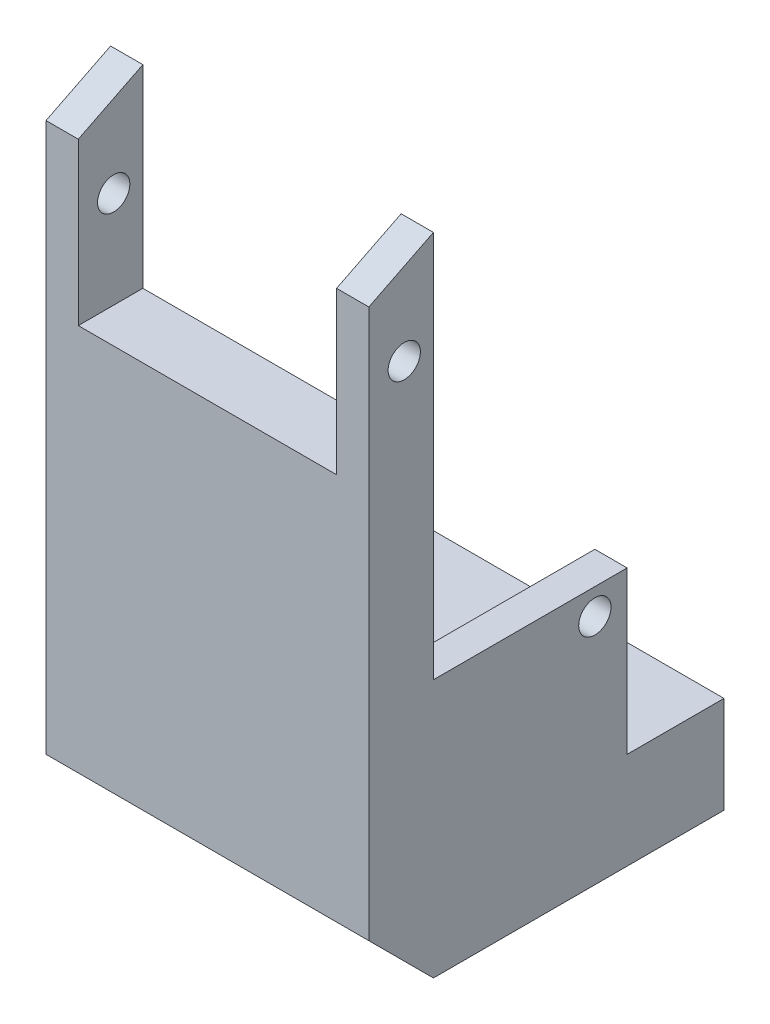
ISO-10303-21;
HEADER;
FILE_DESCRIPTION(('STEP AP214'),'2;1');
FILE_NAME('part.step','',(''),(''),'','','');
FILE_SCHEMA(('AUTOMOTIVE_DESIGN { 1 0 10303 214 1 1 1 1 }'));
ENDSEC;
DATA;
#1=APPLICATION_CONTEXT('core data for automotive mechanical design processes');
#2=APPLICATION_PROTOCOL_DEFINITION('international standard','automotive_design',2000,#1);
#3=PRODUCT_CONTEXT('',#1,'mechanical');
#4=PRODUCT('Part','Part','',(#3));
#5=PRODUCT_RELATED_PRODUCT_CATEGORY('part','',(#4));
#6=PRODUCT_DEFINITION_FORMATION('','',#4);
#7=PRODUCT_DEFINITION_CONTEXT('part definition',#1,'design');
#8=PRODUCT_DEFINITION('design','',#6,#7);
#9=PRODUCT_DEFINITION_SHAPE('','',#8);
#10=(LENGTH_UNIT() NAMED_UNIT(*) SI_UNIT(.MILLI.,.METRE.));
#11=(NAMED_UNIT(*) PLANE_ANGLE_UNIT() SI_UNIT($,.RADIAN.));
#12=(NAMED_UNIT(*) SI_UNIT($,.STERADIAN.) SOLID_ANGLE_UNIT());
#13=UNCERTAINTY_MEASURE_WITH_UNIT(LENGTH_MEASURE(1.E-05),#10,'distance_accuracy_value','');
#14=(GEOMETRIC_REPRESENTATION_CONTEXT(3) GLOBAL_UNCERTAINTY_ASSIGNED_CONTEXT((#13)) GLOBAL_UNIT_ASSIGNED_CONTEXT((#10,
#11,#12)) REPRESENTATION_CONTEXT('',''));
#15=CARTESIAN_POINT('',(0.,0.,0.));
#16=DIRECTION('',(0.,0.,1.));
#17=DIRECTION('',(1.,0.,0.));
#18=AXIS2_PLACEMENT_3D('',#15,#16,#17);
#19=CARTESIAN_POINT('',(6.13636363636363,15.9472809789258,6.78508203182505));
#20=DIRECTION('',(-1.,0.,0.));
#21=DIRECTION('',(0.,-1.,0.));
#22=AXIS2_PLACEMENT_3D('',#19,#20,#21);
#23=PLANE('',#22);
#24=CARTESIAN_POINT('',(6.13636363636363,0.238190069834882,-1.80582705908404));
#25=DIRECTION('',(1.,0.,0.));
#26=DIRECTION('',(0.,1.,0.));
#27=AXIS2_PLACEMENT_3D('',#24,#25,#26);
#28=CIRCLE('',#27,0.613636363636364);
#29=CARTESIAN_POINT('',(6.13636363636363,0.851826433471246,-1.80582705908404));
#30=VERTEX_POINT('',#29);
#31=EDGE_CURVE('E380',#30,#30,#28,.T.);
#32=ORIENTED_EDGE('',*,*,#31,.F.);
#33=EDGE_LOOP('',(#32));
#34=FACE_BOUND('',#33,.T.);
#35=CARTESIAN_POINT('',(6.13636363636363,12.2654627971076,5.43973547101746));
#36=DIRECTION('',(1.,0.,0.));
#37=DIRECTION('',(0.,1.,0.));
#38=AXIS2_PLACEMENT_3D('',#35,#36,#37);
#39=CIRCLE('',#38,0.613636363636365);
#40=CARTESIAN_POINT('',(6.13636363636363,12.879099160744,5.43973547101746));
#41=VERTEX_POINT('',#40);
#42=EDGE_CURVE('E393',#41,#41,#39,.T.);
#43=ORIENTED_EDGE('',*,*,#42,.F.);
#44=EDGE_LOOP('',(#43));
#45=FACE_BOUND('',#44,.T.);
#46=DIRECTION('',(0.,0.,-1.));
#47=VECTOR('',#46,1.);
#48=CARTESIAN_POINT('',(6.13636363636364,-8.59817356652876,6.78508203182505));
#49=LINE('',#48,#47);
#50=CARTESIAN_POINT('',(6.13636363636364,-8.59817356652876,4.33053657727959));
#51=VERTEX_POINT('',#50);
#52=CARTESIAN_POINT('',(6.13636363636364,-8.59817356652876,-6.71491796817495));
#53=VERTEX_POINT('',#52);
#54=EDGE_CURVE('E206',#51,#53,#49,.T.);
#55=ORIENTED_EDGE('',*,*,#54,.T.);
#56=DIRECTION('',(0.,-1.,0.));
#57=VECTOR('',#56,1.);
#58=CARTESIAN_POINT('',(6.13636363636364,-8.59817356652876,-6.71491796817495));
#59=LINE('',#58,#57);
#60=CARTESIAN_POINT('',(6.13636363636364,-4.91635538471057,-6.71491796817495));
#61=VERTEX_POINT('',#60);
#62=EDGE_CURVE('E184',#61,#53,#59,.T.);
#63=ORIENTED_EDGE('',*,*,#62,.F.);
#64=DIRECTION('',(0.,0.,-1.));
#65=VECTOR('',#64,1.);
#66=CARTESIAN_POINT('',(6.13636363636364,-4.91635538471057,-6.71491796817495));
#67=LINE('',#66,#65);
#68=CARTESIAN_POINT('',(6.13636363636364,-4.91635538471057,-3.03309978635677));
#69=VERTEX_POINT('',#68);
#70=EDGE_CURVE('E167',#69,#61,#67,.T.);
#71=ORIENTED_EDGE('',*,*,#70,.F.);
#72=DIRECTION('',(0.,1.,0.));
#73=VECTOR('',#72,1.);
#74=CARTESIAN_POINT('',(6.13636363636363,15.9472809789258,-3.03309978635677));
#75=LINE('',#74,#73);
#76=CARTESIAN_POINT('',(6.13636363636363,1.22000825165306,-3.03309978635677));
#77=VERTEX_POINT('',#76);
#78=EDGE_CURVE('E181',#69,#77,#75,.T.);
#79=ORIENTED_EDGE('',*,*,#78,.T.);
#80=DIRECTION('',(0.,0.,-1.));
#81=VECTOR('',#80,1.);
#82=CARTESIAN_POINT('',(6.13636363636363,1.22000825165306,6.78508203182505));
#83=LINE('',#82,#81);
#84=CARTESIAN_POINT('',(6.13636363636363,1.22000825165306,4.3305365772796));
#85=VERTEX_POINT('',#84);
#86=EDGE_CURVE('E216',#85,#77,#83,.T.);
#87=ORIENTED_EDGE('',*,*,#86,.F.);
#88=DIRECTION('',(0.,-1.,0.));
#89=VECTOR('',#88,1.);
#90=CARTESIAN_POINT('',(6.13636363636363,15.9472809789258,4.3305365772796));
#91=LINE('',#90,#89);
#92=CARTESIAN_POINT('',(6.13636363636363,15.9472809789258,4.3305365772796));
#93=VERTEX_POINT('',#92);
#94=EDGE_CURVE('E52',#93,#85,#91,.T.);
#95=ORIENTED_EDGE('',*,*,#94,.F.);
#96=DIRECTION('',(0.,0.447213595499958,-0.894427190999916));
#97=VECTOR('',#96,1.);
#98=CARTESIAN_POINT('',(6.13636363636363,14.9654627971076,6.29417294091596));
#99=LINE('',#98,#97);
#100=CARTESIAN_POINT('',(6.13636363636363,14.7200082516531,6.78508203182505));
#101=VERTEX_POINT('',#100);
#102=EDGE_CURVE('E212',#101,#93,#99,.T.);
#103=ORIENTED_EDGE('',*,*,#102,.F.);
#104=DIRECTION('',(0.,1.,0.));
#105=VECTOR('',#104,1.);
#106=CARTESIAN_POINT('',(6.13636363636363,15.9472809789258,6.78508203182505));
#107=LINE('',#106,#105);
#108=CARTESIAN_POINT('',(6.13636363636363,-6.1436281119833,6.78508203182505));
#109=VERTEX_POINT('',#108);
#110=EDGE_CURVE('E199',#109,#101,#107,.T.);
#111=ORIENTED_EDGE('',*,*,#110,.F.);
#112=DIRECTION('',(0.,-0.707106781186548,-0.707106781186548));
#113=VECTOR('',#112,1.);
#114=CARTESIAN_POINT('',(6.13636363636363,4.90182643347125,17.8305365772796));
#115=LINE('',#114,#113);
#116=EDGE_CURVE('E11',#109,#51,#115,.T.);
#117=ORIENTED_EDGE('',*,*,#116,.T.);
#118=EDGE_LOOP('',(#55,#63,#71,#79,#87,#95,#103,#111,#117));
#119=FACE_BOUND('',#118,.T.);
#120=ADVANCED_FACE('F42',(#34,#45,#119),#23,.F.);
#121=CARTESIAN_POINT('',(6.13636363636364,-8.59817356652876,6.78508203182505));
#122=DIRECTION('',(0.,1.,0.));
#123=DIRECTION('',(0.,0.,1.));
#124=AXIS2_PLACEMENT_3D('',#121,#122,#123);
#125=PLANE('',#124);
#126=DIRECTION('',(0.,0.,-1.));
#127=VECTOR('',#126,1.);
#128=CARTESIAN_POINT('',(-6.13636363636363,-8.59817356652876,6.78508203182505));
#129=LINE('',#128,#127);
#130=CARTESIAN_POINT('',(-6.13636363636363,-8.59817356652876,4.3305365772796));
#131=VERTEX_POINT('',#130);
#132=CARTESIAN_POINT('',(-6.13636363636363,-8.59817356652876,-6.71491796817495));
#133=VERTEX_POINT('',#132);
#134=EDGE_CURVE('E209',#131,#133,#129,.T.);
#135=ORIENTED_EDGE('',*,*,#134,.T.);
#136=DIRECTION('',(-1.,0.,0.));
#137=VECTOR('',#136,1.);
#138=CARTESIAN_POINT('',(6.13636363636364,-8.59817356652876,-6.71491796817495));
#139=LINE('',#138,#137);
#140=EDGE_CURVE('E377',#53,#133,#139,.T.);
#141=ORIENTED_EDGE('',*,*,#140,.F.);
#142=ORIENTED_EDGE('',*,*,#54,.F.);
#143=DIRECTION('',(-1.,0.,0.));
#144=VECTOR('',#143,1.);
#145=CARTESIAN_POINT('',(44.1030950397754,-8.59817356652875,4.3305365772796));
#146=LINE('',#145,#144);
#147=EDGE_CURVE('E60',#51,#131,#146,.T.);
#148=ORIENTED_EDGE('',*,*,#147,.T.);
#149=EDGE_LOOP('',(#135,#141,#142,#148));
#150=FACE_BOUND('',#149,.T.);
#151=ADVANCED_FACE('F361',(#150),#125,.F.);
#152=CARTESIAN_POINT('',(0.,3.67455370619852,-3.03309978635677));
#153=DIRECTION('',(0.,0.,-1.));
#154=DIRECTION('',(-1.,0.,0.));
#155=AXIS2_PLACEMENT_3D('',#152,#153,#154);
#156=PLANE('',#155);
#157=ORIENTED_EDGE('',*,*,#78,.F.);
#158=DIRECTION('',(-1.,0.,0.));
#159=VECTOR('',#158,1.);
#160=CARTESIAN_POINT('',(42.5690041306845,-4.91635538471057,-3.03309978635677));
#161=LINE('',#160,#159);
#162=CARTESIAN_POINT('',(4.90909090909091,-4.91635538471058,-3.03309978635677));
#163=VERTEX_POINT('',#162);
#164=EDGE_CURVE('E164',#69,#163,#161,.T.);
#165=ORIENTED_EDGE('',*,*,#164,.T.);
#166=DIRECTION('',(0.,1.,0.));
#167=VECTOR('',#166,1.);
#168=CARTESIAN_POINT('',(4.90909090909091,-4.91635538471057,-3.03309978635677));
#169=LINE('',#168,#167);
#170=CARTESIAN_POINT('',(4.90909090909091,1.22000825165306,-3.03309978635677));
#171=VERTEX_POINT('',#170);
#172=EDGE_CURVE('E235',#163,#171,#169,.T.);
#173=ORIENTED_EDGE('',*,*,#172,.T.);
#174=DIRECTION('',(-1.,0.,0.));
#175=VECTOR('',#174,1.);
#176=CARTESIAN_POINT('',(42.5690041306845,1.22000825165307,-3.03309978635677));
#177=LINE('',#176,#175);
#178=EDGE_CURVE('E190',#77,#171,#177,.T.);
#179=ORIENTED_EDGE('',*,*,#178,.F.);
#180=EDGE_LOOP('',(#157,#165,#173,#179));
#181=FACE_BOUND('',#180,.T.);
#182=ADVANCED_FACE('F188',(#181),#156,.T.);
#183=DIRECTION('',(0.,1.,0.));
#184=VECTOR('',#183,1.);
#185=CARTESIAN_POINT('',(-4.90909090909091,-4.91635538471058,-3.03309978635677));
#186=LINE('',#185,#184);
#187=CARTESIAN_POINT('',(-4.90909090909091,-4.91635538471057,-3.03309978635677));
#188=VERTEX_POINT('',#187);
#189=CARTESIAN_POINT('',(-4.9090909090909,1.22000825165306,-3.03309978635677));
#190=VERTEX_POINT('',#189);
#191=EDGE_CURVE('E256',#188,#190,#186,.T.);
#192=ORIENTED_EDGE('',*,*,#191,.F.);
#193=CARTESIAN_POINT('',(-6.13636363636364,-4.91635538471057,-3.03309978635677));
#194=VERTEX_POINT('',#193);
#195=EDGE_CURVE('E177',#188,#194,#161,.T.);
#196=ORIENTED_EDGE('',*,*,#195,.T.);
#197=DIRECTION('',(0.,-1.,0.));
#198=VECTOR('',#197,1.);
#199=CARTESIAN_POINT('',(-6.13636363636364,15.9472809789258,-3.03309978635677));
#200=LINE('',#199,#198);
#201=CARTESIAN_POINT('',(-6.13636363636364,1.22000825165306,-3.03309978635677));
#202=VERTEX_POINT('',#201);
#203=EDGE_CURVE('E194',#202,#194,#200,.T.);
#204=ORIENTED_EDGE('',*,*,#203,.F.);
#205=EDGE_CURVE('E287',#190,#202,#177,.T.);
#206=ORIENTED_EDGE('',*,*,#205,.F.);
#207=EDGE_LOOP('',(#192,#196,#204,#206));
#208=FACE_BOUND('',#207,.T.);
#209=ADVANCED_FACE('F413',(#208),#156,.T.);
#210=CARTESIAN_POINT('',(0.,3.67455370619852,6.78508203182505));
#211=DIRECTION('',(0.,0.,-1.));
#212=DIRECTION('',(-1.,0.,0.));
#213=AXIS2_PLACEMENT_3D('',#210,#211,#212);
#214=PLANE('',#213);
#215=DIRECTION('',(-1.,0.,0.));
#216=VECTOR('',#215,1.);
#217=CARTESIAN_POINT('',(44.1030950397754,-6.1436281119833,6.78508203182505));
#218=LINE('',#217,#216);
#219=CARTESIAN_POINT('',(-6.13636363636363,-6.1436281119833,6.78508203182505));
#220=VERTEX_POINT('',#219);
#221=EDGE_CURVE('E176',#109,#220,#218,.T.);
#222=ORIENTED_EDGE('',*,*,#221,.F.);
#223=ORIENTED_EDGE('',*,*,#110,.T.);
#224=DIRECTION('',(-1.,0.,0.));
#225=VECTOR('',#224,1.);
#226=CARTESIAN_POINT('',(57.9099132215936,14.7200082516531,6.78508203182505));
#227=LINE('',#226,#225);
#228=CARTESIAN_POINT('',(4.90909090909091,14.7200082516531,6.78508203182505));
#229=VERTEX_POINT('',#228);
#230=EDGE_CURVE('E305',#101,#229,#227,.T.);
#231=ORIENTED_EDGE('',*,*,#230,.T.);
#232=DIRECTION('',(0.,-1.,0.));
#233=VECTOR('',#232,1.);
#234=CARTESIAN_POINT('',(4.90909090909091,3.67455370619852,6.78508203182505));
#235=LINE('',#234,#233);
#236=CARTESIAN_POINT('',(4.90909090909091,8.58364461528942,6.78508203182505));
#237=VERTEX_POINT('',#236);
#238=EDGE_CURVE('E273',#229,#237,#235,.T.);
#239=ORIENTED_EDGE('',*,*,#238,.T.);
#240=DIRECTION('',(-1.,0.,0.));
#241=VECTOR('',#240,1.);
#242=CARTESIAN_POINT('',(0.,8.58364461528942,6.78508203182505));
#243=LINE('',#242,#241);
#244=CARTESIAN_POINT('',(-4.90909090909091,8.58364461528942,6.78508203182505));
#245=VERTEX_POINT('',#244);
#246=EDGE_CURVE('E334',#237,#245,#243,.T.);
#247=ORIENTED_EDGE('',*,*,#246,.T.);
#248=DIRECTION('',(0.,1.,0.));
#249=VECTOR('',#248,1.);
#250=CARTESIAN_POINT('',(-4.90909090909092,3.67455370619852,6.78508203182505));
#251=LINE('',#250,#249);
#252=CARTESIAN_POINT('',(-4.90909090909091,14.7200082516531,6.78508203182505));
#253=VERTEX_POINT('',#252);
#254=EDGE_CURVE('E325',#245,#253,#251,.T.);
#255=ORIENTED_EDGE('',*,*,#254,.T.);
#256=CARTESIAN_POINT('',(-6.13636363636364,14.7200082516531,6.78508203182505));
#257=VERTEX_POINT('',#256);
#258=EDGE_CURVE('E299',#253,#257,#227,.T.);
#259=ORIENTED_EDGE('',*,*,#258,.T.);
#260=DIRECTION('',(0.,-1.,0.));
#261=VECTOR('',#260,1.);
#262=CARTESIAN_POINT('',(-6.13636363636364,15.9472809789258,6.78508203182505));
#263=LINE('',#262,#261);
#264=EDGE_CURVE('E193',#257,#220,#263,.T.);
#265=ORIENTED_EDGE('',*,*,#264,.T.);
#266=EDGE_LOOP('',(#222,#223,#231,#239,#247,#255,#259,#265));
#267=FACE_BOUND('',#266,.T.);
#268=ADVANCED_FACE('F316',(#267),#214,.F.);
#269=CARTESIAN_POINT('',(57.9099132215936,14.7200082516531,6.78508203182505));
#270=DIRECTION('',(0.,0.894427190999916,0.447213595499958));
#271=DIRECTION('',(0.,-0.447213595499958,0.894427190999916));
#272=AXIS2_PLACEMENT_3D('',#269,#270,#271);
#273=PLANE('',#272);
#274=DIRECTION('',(0.,0.447213595499958,-0.894427190999916));
#275=VECTOR('',#274,1.);
#276=CARTESIAN_POINT('',(4.90909090909091,14.7200082516531,6.78508203182506));
#277=LINE('',#276,#275);
#278=CARTESIAN_POINT('',(4.90909090909091,15.9472809789258,4.3305365772796));
#279=VERTEX_POINT('',#278);
#280=EDGE_CURVE('E323',#229,#279,#277,.T.);
#281=ORIENTED_EDGE('',*,*,#280,.F.);
#282=ORIENTED_EDGE('',*,*,#230,.F.);
#283=ORIENTED_EDGE('',*,*,#102,.T.);
#284=DIRECTION('',(-1.,0.,0.));
#285=VECTOR('',#284,1.);
#286=CARTESIAN_POINT('',(57.9099132215936,15.9472809789258,4.3305365772796));
#287=LINE('',#286,#285);
#288=EDGE_CURVE('E300',#93,#279,#287,.T.);
#289=ORIENTED_EDGE('',*,*,#288,.T.);
#290=EDGE_LOOP('',(#281,#282,#283,#289));
#291=FACE_BOUND('',#290,.T.);
#292=ADVANCED_FACE('F322',(#291),#273,.T.);
#293=CARTESIAN_POINT('',(42.5690041306845,1.22000825165307,4.3305365772796));
#294=DIRECTION('',(0.,1.,0.));
#295=DIRECTION('',(-1.,0.,0.));
#296=AXIS2_PLACEMENT_3D('',#293,#294,#295);
#297=PLANE('',#296);
#298=DIRECTION('',(0.,0.,-1.));
#299=VECTOR('',#298,1.);
#300=CARTESIAN_POINT('',(4.90909090909091,1.22000825165306,4.3305365772796));
#301=LINE('',#300,#299);
#302=CARTESIAN_POINT('',(4.90909090909091,1.22000825165306,4.3305365772796));
#303=VERTEX_POINT('',#302);
#304=EDGE_CURVE('E275',#303,#171,#301,.T.);
#305=ORIENTED_EDGE('',*,*,#304,.F.);
#306=DIRECTION('',(-1.,0.,0.));
#307=VECTOR('',#306,1.);
#308=CARTESIAN_POINT('',(42.5690041306845,1.22000825165307,4.3305365772796));
#309=LINE('',#308,#307);
#310=EDGE_CURVE('E288',#85,#303,#309,.T.);
#311=ORIENTED_EDGE('',*,*,#310,.F.);
#312=ORIENTED_EDGE('',*,*,#86,.T.);
#313=ORIENTED_EDGE('',*,*,#178,.T.);
#314=EDGE_LOOP('',(#305,#311,#312,#313));
#315=FACE_BOUND('',#314,.T.);
#316=ADVANCED_FACE('F429',(#315),#297,.T.);
#317=CARTESIAN_POINT('',(-6.13636363636364,15.9472809789258,6.78508203182505));
#318=DIRECTION('',(1.,0.,0.));
#319=DIRECTION('',(0.,1.,0.));
#320=AXIS2_PLACEMENT_3D('',#317,#318,#319);
#321=PLANE('',#320);
#322=CARTESIAN_POINT('',(-6.13636363636364,0.238190069834881,-1.80582705908404));
#323=DIRECTION('',(1.,0.,0.));
#324=DIRECTION('',(0.,1.,0.));
#325=AXIS2_PLACEMENT_3D('',#322,#323,#324);
#326=CIRCLE('',#325,0.613636363636364);
#327=CARTESIAN_POINT('',(-6.13636363636364,0.851826433471245,-1.80582705908404));
#328=VERTEX_POINT('',#327);
#329=EDGE_CURVE('E232',#328,#328,#326,.T.);
#330=ORIENTED_EDGE('',*,*,#329,.T.);
#331=EDGE_LOOP('',(#330));
#332=FACE_BOUND('',#331,.T.);
#333=CARTESIAN_POINT('',(-6.13636363636364,12.2654627971076,5.43973547101746));
#334=DIRECTION('',(1.,0.,0.));
#335=DIRECTION('',(0.,1.,0.));
#336=AXIS2_PLACEMENT_3D('',#333,#334,#335);
#337=CIRCLE('',#336,0.613636363636365);
#338=CARTESIAN_POINT('',(-6.13636363636364,12.879099160744,5.43973547101746));
#339=VERTEX_POINT('',#338);
#340=EDGE_CURVE('E227',#339,#339,#337,.T.);
#341=ORIENTED_EDGE('',*,*,#340,.T.);
#342=EDGE_LOOP('',(#341));
#343=FACE_BOUND('',#342,.T.);
#344=ORIENTED_EDGE('',*,*,#203,.T.);
#345=DIRECTION('',(0.,0.,-1.));
#346=VECTOR('',#345,1.);
#347=CARTESIAN_POINT('',(-6.13636363636364,-4.91635538471057,-6.71491796817495));
#348=LINE('',#347,#346);
#349=CARTESIAN_POINT('',(-6.13636363636364,-4.91635538471057,-6.71491796817495));
#350=VERTEX_POINT('',#349);
#351=EDGE_CURVE('E369',#194,#350,#348,.T.);
#352=ORIENTED_EDGE('',*,*,#351,.T.);
#353=DIRECTION('',(0.,-1.,0.));
#354=VECTOR('',#353,1.);
#355=CARTESIAN_POINT('',(-6.13636363636363,-8.59817356652876,-6.71491796817495));
#356=LINE('',#355,#354);
#357=EDGE_CURVE('E186',#350,#133,#356,.T.);
#358=ORIENTED_EDGE('',*,*,#357,.T.);
#359=ORIENTED_EDGE('',*,*,#134,.F.);
#360=DIRECTION('',(0.,0.707106781186548,0.707106781186548));
#361=VECTOR('',#360,1.);
#362=CARTESIAN_POINT('',(-6.13636363636364,4.90182643347124,17.8305365772796));
#363=LINE('',#362,#361);
#364=EDGE_CURVE('E353',#131,#220,#363,.T.);
#365=ORIENTED_EDGE('',*,*,#364,.T.);
#366=ORIENTED_EDGE('',*,*,#264,.F.);
#367=DIRECTION('',(0.,-0.447213595499958,0.894427190999916));
#368=VECTOR('',#367,1.);
#369=CARTESIAN_POINT('',(-6.13636363636364,14.9654627971076,6.29417294091596));
#370=LINE('',#369,#368);
#371=CARTESIAN_POINT('',(-6.13636363636364,15.9472809789258,4.33053657727961));
#372=VERTEX_POINT('',#371);
#373=EDGE_CURVE('E202',#372,#257,#370,.T.);
#374=ORIENTED_EDGE('',*,*,#373,.F.);
#375=DIRECTION('',(0.,1.,0.));
#376=VECTOR('',#375,1.);
#377=CARTESIAN_POINT('',(-6.13636363636364,15.9472809789258,4.3305365772796));
#378=LINE('',#377,#376);
#379=CARTESIAN_POINT('',(-6.13636363636364,1.22000825165306,4.3305365772796));
#380=VERTEX_POINT('',#379);
#381=EDGE_CURVE('E295',#380,#372,#378,.T.);
#382=ORIENTED_EDGE('',*,*,#381,.F.);
#383=DIRECTION('',(0.,0.,1.));
#384=VECTOR('',#383,1.);
#385=CARTESIAN_POINT('',(-6.13636363636364,1.22000825165306,6.78508203182505));
#386=LINE('',#385,#384);
#387=EDGE_CURVE('E286',#202,#380,#386,.T.);
#388=ORIENTED_EDGE('',*,*,#387,.F.);
#389=EDGE_LOOP('',(#344,#352,#358,#359,#365,#366,#374,#382,#388));
#390=FACE_BOUND('',#389,.T.);
#391=ADVANCED_FACE('F44',(#332,#343,#390),#321,.F.);
#392=DIRECTION('',(0.,-0.447213595499958,0.894427190999916));
#393=VECTOR('',#392,1.);
#394=CARTESIAN_POINT('',(-4.90909090909091,14.7200082516531,6.78508203182505));
#395=LINE('',#394,#393);
#396=CARTESIAN_POINT('',(-4.90909090909091,15.9472809789258,4.3305365772796));
#397=VERTEX_POINT('',#396);
#398=EDGE_CURVE('E329',#397,#253,#395,.T.);
#399=ORIENTED_EDGE('',*,*,#398,.F.);
#400=EDGE_CURVE('E304',#397,#372,#287,.T.);
#401=ORIENTED_EDGE('',*,*,#400,.T.);
#402=ORIENTED_EDGE('',*,*,#373,.T.);
#403=ORIENTED_EDGE('',*,*,#258,.F.);
#404=EDGE_LOOP('',(#399,#401,#402,#403));
#405=FACE_BOUND('',#404,.T.);
#406=ADVANCED_FACE('F416',(#405),#273,.T.);
#407=CARTESIAN_POINT('',(42.5690041306845,15.9472809789258,4.3305365772796));
#408=DIRECTION('',(0.,0.,-1.));
#409=DIRECTION('',(0.,1.,0.));
#410=AXIS2_PLACEMENT_3D('',#407,#408,#409);
#411=PLANE('',#410);
#412=DIRECTION('',(0.,-1.,0.));
#413=VECTOR('',#412,1.);
#414=CARTESIAN_POINT('',(4.90909090909091,15.9472809789258,4.3305365772796));
#415=LINE('',#414,#413);
#416=CARTESIAN_POINT('',(4.90909090909091,8.58364461528942,4.3305365772796));
#417=VERTEX_POINT('',#416);
#418=EDGE_CURVE('E67',#279,#417,#415,.T.);
#419=ORIENTED_EDGE('',*,*,#418,.F.);
#420=ORIENTED_EDGE('',*,*,#288,.F.);
#421=ORIENTED_EDGE('',*,*,#94,.T.);
#422=ORIENTED_EDGE('',*,*,#310,.T.);
#423=DIRECTION('',(0.,1.,0.));
#424=VECTOR('',#423,1.);
#425=CARTESIAN_POINT('',(4.90909090909091,-4.91635538471057,4.3305365772796));
#426=LINE('',#425,#424);
#427=CARTESIAN_POINT('',(4.90909090909091,-4.91635538471057,4.3305365772796));
#428=VERTEX_POINT('',#427);
#429=EDGE_CURVE('E266',#428,#303,#426,.T.);
#430=ORIENTED_EDGE('',*,*,#429,.F.);
#431=DIRECTION('',(1.,0.,0.));
#432=VECTOR('',#431,1.);
#433=CARTESIAN_POINT('',(-4.90909090909091,-4.91635538471058,4.3305365772796));
#434=LINE('',#433,#432);
#435=CARTESIAN_POINT('',(-4.90909090909091,-4.91635538471058,4.3305365772796));
#436=VERTEX_POINT('',#435);
#437=EDGE_CURVE('E254',#436,#428,#434,.T.);
#438=ORIENTED_EDGE('',*,*,#437,.F.);
#439=DIRECTION('',(0.,1.,0.));
#440=VECTOR('',#439,1.);
#441=CARTESIAN_POINT('',(-4.90909090909091,-4.91635538471058,4.3305365772796));
#442=LINE('',#441,#440);
#443=CARTESIAN_POINT('',(-4.90909090909091,1.22000825165306,4.3305365772796));
#444=VERTEX_POINT('',#443);
#445=EDGE_CURVE('E258',#436,#444,#442,.T.);
#446=ORIENTED_EDGE('',*,*,#445,.T.);
#447=EDGE_CURVE('E282',#444,#380,#309,.T.);
#448=ORIENTED_EDGE('',*,*,#447,.T.);
#449=ORIENTED_EDGE('',*,*,#381,.T.);
#450=ORIENTED_EDGE('',*,*,#400,.F.);
#451=DIRECTION('',(0.,1.,0.));
#452=VECTOR('',#451,1.);
#453=CARTESIAN_POINT('',(-4.90909090909091,15.9472809789258,4.3305365772796));
#454=LINE('',#453,#452);
#455=CARTESIAN_POINT('',(-4.90909090909091,8.58364461528943,4.3305365772796));
#456=VERTEX_POINT('',#455);
#457=EDGE_CURVE('E342',#456,#397,#454,.T.);
#458=ORIENTED_EDGE('',*,*,#457,.F.);
#459=DIRECTION('',(-1.,0.,0.));
#460=VECTOR('',#459,1.);
#461=CARTESIAN_POINT('',(-4.90909090909091,8.58364461528943,4.3305365772796));
#462=LINE('',#461,#460);
#463=EDGE_CURVE('E347',#417,#456,#462,.T.);
#464=ORIENTED_EDGE('',*,*,#463,.F.);
#465=EDGE_LOOP('',(#419,#420,#421,#422,#430,#438,#446,#448,#449,#450,#458,#464));
#466=FACE_BOUND('',#465,.T.);
#467=ADVANCED_FACE('F419',(#466),#411,.T.);
#468=DIRECTION('',(0.,0.,1.));
#469=VECTOR('',#468,1.);
#470=CARTESIAN_POINT('',(-4.90909090909091,1.22000825165306,4.3305365772796));
#471=LINE('',#470,#469);
#472=EDGE_CURVE('E278',#190,#444,#471,.T.);
#473=ORIENTED_EDGE('',*,*,#472,.F.);
#474=ORIENTED_EDGE('',*,*,#205,.T.);
#475=ORIENTED_EDGE('',*,*,#387,.T.);
#476=ORIENTED_EDGE('',*,*,#447,.F.);
#477=EDGE_LOOP('',(#473,#474,#475,#476));
#478=FACE_BOUND('',#477,.T.);
#479=ADVANCED_FACE('F423',(#478),#297,.T.);
#480=CARTESIAN_POINT('',(4.90909090909091,-4.91635538471057,4.3305365772796));
#481=DIRECTION('',(1.,0.,0.));
#482=DIRECTION('',(0.,1.,0.));
#483=AXIS2_PLACEMENT_3D('',#480,#481,#482);
#484=PLANE('',#483);
#485=CARTESIAN_POINT('',(4.90909090909091,0.238190069834882,-1.80582705908404));
#486=DIRECTION('',(1.,0.,0.));
#487=DIRECTION('',(0.,1.,0.));
#488=AXIS2_PLACEMENT_3D('',#485,#486,#487);
#489=CIRCLE('',#488,0.613636363636364);
#490=CARTESIAN_POINT('',(4.90909090909091,0.851826433471246,-1.80582705908404));
#491=VERTEX_POINT('',#490);
#492=EDGE_CURVE('E231',#491,#491,#489,.T.);
#493=ORIENTED_EDGE('',*,*,#492,.T.);
#494=EDGE_LOOP('',(#493));
#495=FACE_BOUND('',#494,.T.);
#496=ORIENTED_EDGE('',*,*,#304,.T.);
#497=ORIENTED_EDGE('',*,*,#172,.F.);
#498=DIRECTION('',(0.,0.,-1.));
#499=VECTOR('',#498,1.);
#500=CARTESIAN_POINT('',(4.90909090909091,-4.91635538471057,4.3305365772796));
#501=LINE('',#500,#499);
#502=EDGE_CURVE('E170',#428,#163,#501,.T.);
#503=ORIENTED_EDGE('',*,*,#502,.F.);
#504=ORIENTED_EDGE('',*,*,#429,.T.);
#505=EDGE_LOOP('',(#496,#497,#503,#504));
#506=FACE_BOUND('',#505,.T.);
#507=ADVANCED_FACE('F427',(#495,#506),#484,.F.);
#508=CARTESIAN_POINT('',(-4.90909090909091,-4.91635538471058,4.3305365772796));
#509=DIRECTION('',(-1.,0.,0.));
#510=DIRECTION('',(0.,-1.,0.));
#511=AXIS2_PLACEMENT_3D('',#508,#509,#510);
#512=PLANE('',#511);
#513=CARTESIAN_POINT('',(-4.90909090909091,0.238190069834881,-1.80582705908404));
#514=DIRECTION('',(-1.,0.,0.));
#515=DIRECTION('',(0.,-1.,0.));
#516=AXIS2_PLACEMENT_3D('',#513,#514,#515);
#517=CIRCLE('',#516,0.613636363636364);
#518=CARTESIAN_POINT('',(-4.90909090909091,-0.375446293801483,-1.80582705908404));
#519=VERTEX_POINT('',#518);
#520=EDGE_CURVE('E228',#519,#519,#517,.T.);
#521=ORIENTED_EDGE('',*,*,#520,.T.);
#522=EDGE_LOOP('',(#521));
#523=FACE_BOUND('',#522,.T.);
#524=ORIENTED_EDGE('',*,*,#472,.T.);
#525=ORIENTED_EDGE('',*,*,#445,.F.);
#526=DIRECTION('',(0.,0.,1.));
#527=VECTOR('',#526,1.);
#528=CARTESIAN_POINT('',(-4.90909090909091,-4.91635538471058,4.3305365772796));
#529=LINE('',#528,#527);
#530=EDGE_CURVE('E250',#188,#436,#529,.T.);
#531=ORIENTED_EDGE('',*,*,#530,.F.);
#532=ORIENTED_EDGE('',*,*,#191,.T.);
#533=EDGE_LOOP('',(#524,#525,#531,#532));
#534=FACE_BOUND('',#533,.T.);
#535=ADVANCED_FACE('F432',(#523,#534),#512,.F.);
#536=CARTESIAN_POINT('',(0.,-4.91635538471058,-3.03309978635677));
#537=DIRECTION('',(0.,-1.,0.));
#538=DIRECTION('',(1.,0.,0.));
#539=AXIS2_PLACEMENT_3D('',#536,#537,#538);
#540=PLANE('',#539);
#541=ORIENTED_EDGE('',*,*,#502,.T.);
#542=ORIENTED_EDGE('',*,*,#164,.F.);
#543=ORIENTED_EDGE('',*,*,#70,.T.);
#544=DIRECTION('',(-1.,0.,0.));
#545=VECTOR('',#544,1.);
#546=CARTESIAN_POINT('',(6.13636363636364,-4.91635538471057,-6.71491796817495));
#547=LINE('',#546,#545);
#548=EDGE_CURVE('E381',#61,#350,#547,.T.);
#549=ORIENTED_EDGE('',*,*,#548,.T.);
#550=ORIENTED_EDGE('',*,*,#351,.F.);
#551=ORIENTED_EDGE('',*,*,#195,.F.);
#552=ORIENTED_EDGE('',*,*,#530,.T.);
#553=ORIENTED_EDGE('',*,*,#437,.T.);
#554=EDGE_LOOP('',(#541,#542,#543,#549,#550,#551,#552,#553));
#555=FACE_BOUND('',#554,.T.);
#556=ADVANCED_FACE('F166',(#555),#540,.F.);
#557=CARTESIAN_POINT('',(4.90909090909091,15.9472809789258,10.4669002136432));
#558=DIRECTION('',(1.,0.,0.));
#559=DIRECTION('',(0.,1.,0.));
#560=AXIS2_PLACEMENT_3D('',#557,#558,#559);
#561=PLANE('',#560);
#562=CARTESIAN_POINT('',(4.90909090909091,12.2654627971076,5.43973547101746));
#563=DIRECTION('',(1.,0.,0.));
#564=DIRECTION('',(0.,1.,0.));
#565=AXIS2_PLACEMENT_3D('',#562,#563,#564);
#566=CIRCLE('',#565,0.613636363636365);
#567=CARTESIAN_POINT('',(4.90909090909091,12.879099160744,5.43973547101746));
#568=VERTEX_POINT('',#567);
#569=EDGE_CURVE('E226',#568,#568,#566,.T.);
#570=ORIENTED_EDGE('',*,*,#569,.T.);
#571=EDGE_LOOP('',(#570));
#572=FACE_BOUND('',#571,.T.);
#573=ORIENTED_EDGE('',*,*,#280,.T.);
#574=ORIENTED_EDGE('',*,*,#418,.T.);
#575=DIRECTION('',(0.,0.,-1.));
#576=VECTOR('',#575,1.);
#577=CARTESIAN_POINT('',(4.90909090909091,8.58364461528942,10.4669002136432));
#578=LINE('',#577,#576);
#579=EDGE_CURVE('E339',#237,#417,#578,.T.);
#580=ORIENTED_EDGE('',*,*,#579,.F.);
#581=ORIENTED_EDGE('',*,*,#238,.F.);
#582=EDGE_LOOP('',(#573,#574,#580,#581));
#583=FACE_BOUND('',#582,.T.);
#584=ADVANCED_FACE('F439',(#572,#583),#561,.F.);
#585=CARTESIAN_POINT('',(-4.90909090909091,15.9472809789258,10.4669002136432));
#586=DIRECTION('',(-1.,0.,0.));
#587=DIRECTION('',(0.,-1.,0.));
#588=AXIS2_PLACEMENT_3D('',#585,#586,#587);
#589=PLANE('',#588);
#590=CARTESIAN_POINT('',(-4.90909090909091,12.2654627971076,5.43973547101746));
#591=DIRECTION('',(-1.,0.,0.));
#592=DIRECTION('',(0.,-1.,0.));
#593=AXIS2_PLACEMENT_3D('',#590,#591,#592);
#594=CIRCLE('',#593,0.613636363636365);
#595=CARTESIAN_POINT('',(-4.90909090909091,11.6518264334712,5.43973547101746));
#596=VERTEX_POINT('',#595);
#597=EDGE_CURVE('E222',#596,#596,#594,.T.);
#598=ORIENTED_EDGE('',*,*,#597,.T.);
#599=EDGE_LOOP('',(#598));
#600=FACE_BOUND('',#599,.T.);
#601=DIRECTION('',(0.,0.,-1.));
#602=VECTOR('',#601,1.);
#603=CARTESIAN_POINT('',(-4.90909090909091,8.58364461528942,10.4669002136432));
#604=LINE('',#603,#602);
#605=EDGE_CURVE('E338',#245,#456,#604,.T.);
#606=ORIENTED_EDGE('',*,*,#605,.T.);
#607=ORIENTED_EDGE('',*,*,#457,.T.);
#608=ORIENTED_EDGE('',*,*,#398,.T.);
#609=ORIENTED_EDGE('',*,*,#254,.F.);
#610=EDGE_LOOP('',(#606,#607,#608,#609));
#611=FACE_BOUND('',#610,.T.);
#612=ADVANCED_FACE('F442',(#600,#611),#589,.F.);
#613=CARTESIAN_POINT('',(-4.90909090909091,8.58364461528942,10.4669002136432));
#614=DIRECTION('',(0.,-1.,0.));
#615=DIRECTION('',(0.,0.,-1.));
#616=AXIS2_PLACEMENT_3D('',#613,#614,#615);
#617=PLANE('',#616);
#618=ORIENTED_EDGE('',*,*,#579,.T.);
#619=ORIENTED_EDGE('',*,*,#463,.T.);
#620=ORIENTED_EDGE('',*,*,#605,.F.);
#621=ORIENTED_EDGE('',*,*,#246,.F.);
#622=EDGE_LOOP('',(#618,#619,#620,#621));
#623=FACE_BOUND('',#622,.T.);
#624=ADVANCED_FACE('F444',(#623),#617,.F.);
#625=CARTESIAN_POINT('',(44.1030950397754,-6.1436281119833,6.78508203182505));
#626=DIRECTION('',(0.,0.707106781186548,-0.707106781186548));
#627=DIRECTION('',(0.,0.707106781186548,0.707106781186548));
#628=AXIS2_PLACEMENT_3D('',#625,#626,#627);
#629=PLANE('',#628);
#630=ORIENTED_EDGE('',*,*,#364,.F.);
#631=ORIENTED_EDGE('',*,*,#147,.F.);
#632=ORIENTED_EDGE('',*,*,#116,.F.);
#633=ORIENTED_EDGE('',*,*,#221,.T.);
#634=EDGE_LOOP('',(#630,#631,#632,#633));
#635=FACE_BOUND('',#634,.T.);
#636=ADVANCED_FACE('F447',(#635),#629,.F.);
#637=CARTESIAN_POINT('',(-6.13636363636364,12.2654627971076,5.43973547101746));
#638=DIRECTION('',(1.,0.,0.));
#639=DIRECTION('',(0.,1.,0.));
#640=AXIS2_PLACEMENT_3D('',#637,#638,#639);
#641=CYLINDRICAL_SURFACE('',#640,0.613636363636365);
#642=ORIENTED_EDGE('',*,*,#340,.F.);
#643=EDGE_LOOP('',(#642));
#644=FACE_BOUND('',#643,.T.);
#645=ORIENTED_EDGE('',*,*,#597,.F.);
#646=EDGE_LOOP('',(#645));
#647=FACE_BOUND('',#646,.T.);
#648=ADVANCED_FACE('F454',(#644,#647),#641,.F.);
#649=ORIENTED_EDGE('',*,*,#42,.T.);
#650=EDGE_LOOP('',(#649));
#651=FACE_BOUND('',#650,.T.);
#652=ORIENTED_EDGE('',*,*,#569,.F.);
#653=EDGE_LOOP('',(#652));
#654=FACE_BOUND('',#653,.T.);
#655=ADVANCED_FACE('F400',(#651,#654),#641,.F.);
#656=CARTESIAN_POINT('',(-6.13636363636364,0.238190069834881,-1.80582705908404));
#657=DIRECTION('',(1.,0.,0.));
#658=DIRECTION('',(0.,1.,0.));
#659=AXIS2_PLACEMENT_3D('',#656,#657,#658);
#660=CYLINDRICAL_SURFACE('',#659,0.613636363636364);
#661=ORIENTED_EDGE('',*,*,#329,.F.);
#662=EDGE_LOOP('',(#661));
#663=FACE_BOUND('',#662,.T.);
#664=ORIENTED_EDGE('',*,*,#520,.F.);
#665=EDGE_LOOP('',(#664));
#666=FACE_BOUND('',#665,.T.);
#667=ADVANCED_FACE('F457',(#663,#666),#660,.F.);
#668=ORIENTED_EDGE('',*,*,#31,.T.);
#669=EDGE_LOOP('',(#668));
#670=FACE_BOUND('',#669,.T.);
#671=ORIENTED_EDGE('',*,*,#492,.F.);
#672=EDGE_LOOP('',(#671));
#673=FACE_BOUND('',#672,.T.);
#674=ADVANCED_FACE('F458',(#670,#673),#660,.F.);
#675=CARTESIAN_POINT('',(6.13636363636364,-8.59817356652876,-6.71491796817495));
#676=DIRECTION('',(0.,0.,-1.));
#677=DIRECTION('',(-1.,0.,0.));
#678=AXIS2_PLACEMENT_3D('',#675,#676,#677);
#679=PLANE('',#678);
#680=ORIENTED_EDGE('',*,*,#357,.F.);
#681=ORIENTED_EDGE('',*,*,#548,.F.);
#682=ORIENTED_EDGE('',*,*,#62,.T.);
#683=ORIENTED_EDGE('',*,*,#140,.T.);
#684=EDGE_LOOP('',(#680,#681,#682,#683));
#685=FACE_BOUND('',#684,.T.);
#686=ADVANCED_FACE('F461',(#685),#679,.T.);
#687=CLOSED_SHELL('',(#120,#151,#182,#209,#268,#292,#316,#391,#406,#467,#479,#507,#535,#556,
#584,#612,#624,#636,#648,#655,#667,#674,#686));
#688=MANIFOLD_SOLID_BREP('B2',#687);
#689=ADVANCED_BREP_SHAPE_REPRESENTATION('',(#18,#688),#14);
#690=SHAPE_DEFINITION_REPRESENTATION(#9,#689);
ENDSEC;
END-ISO-10303-21;
